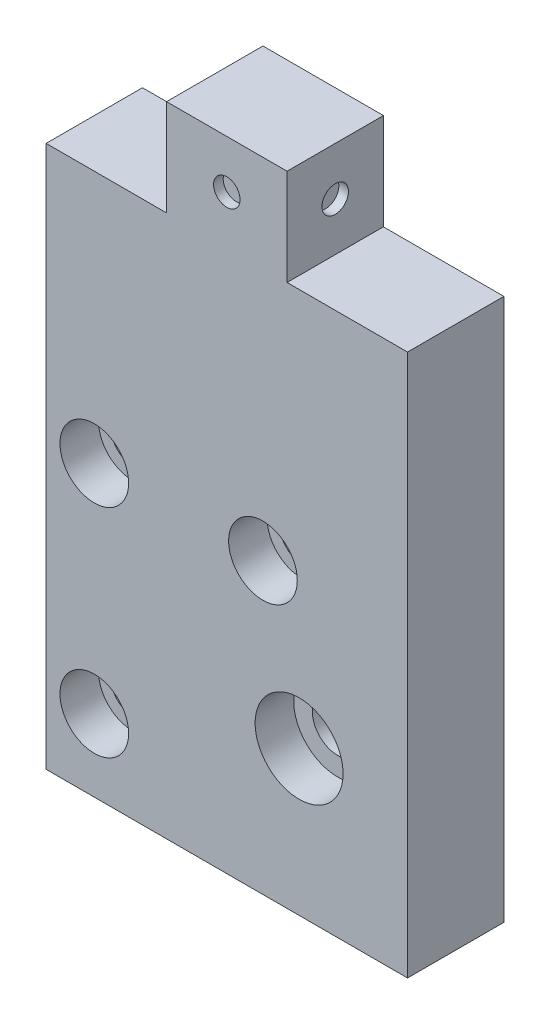
ISO-10303-21;
HEADER;
FILE_DESCRIPTION(('STEP AP214'),'2;1');
FILE_NAME('part.step','',(''),(''),'','','');
FILE_SCHEMA(('AUTOMOTIVE_DESIGN { 1 0 10303 214 1 1 1 1 }'));
ENDSEC;
DATA;
#1=APPLICATION_CONTEXT('core data for automotive mechanical design processes');
#2=APPLICATION_PROTOCOL_DEFINITION('international standard','automotive_design',2000,#1);
#3=PRODUCT_CONTEXT('',#1,'mechanical');
#4=PRODUCT('Part','Part','',(#3));
#5=PRODUCT_RELATED_PRODUCT_CATEGORY('part','',(#4));
#6=PRODUCT_DEFINITION_FORMATION('','',#4);
#7=PRODUCT_DEFINITION_CONTEXT('part definition',#1,'design');
#8=PRODUCT_DEFINITION('design','',#6,#7);
#9=PRODUCT_DEFINITION_SHAPE('','',#8);
#10=(LENGTH_UNIT() NAMED_UNIT(*) SI_UNIT(.MILLI.,.METRE.));
#11=(NAMED_UNIT(*) PLANE_ANGLE_UNIT() SI_UNIT($,.RADIAN.));
#12=(NAMED_UNIT(*) SI_UNIT($,.STERADIAN.) SOLID_ANGLE_UNIT());
#13=UNCERTAINTY_MEASURE_WITH_UNIT(LENGTH_MEASURE(1.E-05),#10,'distance_accuracy_value','');
#14=(GEOMETRIC_REPRESENTATION_CONTEXT(3) GLOBAL_UNCERTAINTY_ASSIGNED_CONTEXT((#13)) GLOBAL_UNIT_ASSIGNED_CONTEXT((#10,
#11,#12)) REPRESENTATION_CONTEXT('',''));
#15=CARTESIAN_POINT('',(0.,0.,0.));
#16=DIRECTION('',(0.,0.,1.));
#17=DIRECTION('',(1.,0.,0.));
#18=AXIS2_PLACEMENT_3D('',#15,#16,#17);
#19=CARTESIAN_POINT('',(5.08,7.62,10.16));
#20=DIRECTION('',(0.,0.,-1.));
#21=DIRECTION('',(-1.,0.,0.));
#22=AXIS2_PLACEMENT_3D('',#19,#20,#21);
#23=CYLINDRICAL_SURFACE('',#22,2.286);
#24=CARTESIAN_POINT('',(5.08,7.62,0.));
#25=DIRECTION('',(0.,0.,1.));
#26=DIRECTION('',(1.,0.,0.));
#27=AXIS2_PLACEMENT_3D('',#24,#25,#26);
#28=CIRCLE('',#27,2.286);
#29=CARTESIAN_POINT('',(7.366,7.62,0.));
#30=VERTEX_POINT('',#29);
#31=EDGE_CURVE('E135',#30,#30,#28,.T.);
#32=ORIENTED_EDGE('',*,*,#31,.F.);
#33=EDGE_LOOP('',(#32));
#34=FACE_BOUND('',#33,.T.);
#35=CARTESIAN_POINT('',(5.08,7.62,6.096));
#36=DIRECTION('',(0.,0.,1.));
#37=DIRECTION('',(1.,0.,0.));
#38=AXIS2_PLACEMENT_3D('',#35,#36,#37);
#39=CIRCLE('',#38,2.286);
#40=CARTESIAN_POINT('',(7.366,7.62,6.096));
#41=VERTEX_POINT('',#40);
#42=EDGE_CURVE('E36',#41,#41,#39,.T.);
#43=ORIENTED_EDGE('',*,*,#42,.T.);
#44=EDGE_LOOP('',(#43));
#45=FACE_BOUND('',#44,.T.);
#46=ADVANCED_FACE('F32',(#34,#45),#23,.F.);
#47=CARTESIAN_POINT('',(5.08,30.48,10.16));
#48=DIRECTION('',(0.,0.,-1.));
#49=DIRECTION('',(-1.,0.,0.));
#50=AXIS2_PLACEMENT_3D('',#47,#48,#49);
#51=CYLINDRICAL_SURFACE('',#50,2.286);
#52=CARTESIAN_POINT('',(5.08,30.48,0.));
#53=DIRECTION('',(0.,0.,1.));
#54=DIRECTION('',(1.,0.,0.));
#55=AXIS2_PLACEMENT_3D('',#52,#53,#54);
#56=CIRCLE('',#55,2.286);
#57=CARTESIAN_POINT('',(7.366,30.48,0.));
#58=VERTEX_POINT('',#57);
#59=EDGE_CURVE('E178',#58,#58,#56,.T.);
#60=ORIENTED_EDGE('',*,*,#59,.F.);
#61=EDGE_LOOP('',(#60));
#62=FACE_BOUND('',#61,.T.);
#63=CARTESIAN_POINT('',(5.08,30.48,6.096));
#64=DIRECTION('',(0.,0.,1.));
#65=DIRECTION('',(1.,0.,0.));
#66=AXIS2_PLACEMENT_3D('',#63,#64,#65);
#67=CIRCLE('',#66,2.286);
#68=CARTESIAN_POINT('',(7.366,30.48,6.096));
#69=VERTEX_POINT('',#68);
#70=EDGE_CURVE('E164',#69,#69,#67,.T.);
#71=ORIENTED_EDGE('',*,*,#70,.T.);
#72=EDGE_LOOP('',(#71));
#73=FACE_BOUND('',#72,.T.);
#74=ADVANCED_FACE('F226',(#62,#73),#51,.F.);
#75=CARTESIAN_POINT('',(26.67,15.24,10.16));
#76=DIRECTION('',(0.,0.,-1.));
#77=DIRECTION('',(-1.,0.,0.));
#78=AXIS2_PLACEMENT_3D('',#75,#76,#77);
#79=CYLINDRICAL_SURFACE('',#78,2.667);
#80=CARTESIAN_POINT('',(26.67,15.24,0.));
#81=DIRECTION('',(0.,0.,1.));
#82=DIRECTION('',(1.,0.,0.));
#83=AXIS2_PLACEMENT_3D('',#80,#81,#82);
#84=CIRCLE('',#83,2.667);
#85=CARTESIAN_POINT('',(29.337,15.24,0.));
#86=VERTEX_POINT('',#85);
#87=EDGE_CURVE('E173',#86,#86,#84,.T.);
#88=ORIENTED_EDGE('',*,*,#87,.F.);
#89=EDGE_LOOP('',(#88));
#90=FACE_BOUND('',#89,.T.);
#91=CARTESIAN_POINT('',(26.67,15.24,6.096));
#92=DIRECTION('',(0.,0.,1.));
#93=DIRECTION('',(1.,0.,0.));
#94=AXIS2_PLACEMENT_3D('',#91,#92,#93);
#95=CIRCLE('',#94,2.667);
#96=CARTESIAN_POINT('',(29.337,15.24,6.096));
#97=VERTEX_POINT('',#96);
#98=EDGE_CURVE('E161',#97,#97,#95,.T.);
#99=ORIENTED_EDGE('',*,*,#98,.T.);
#100=EDGE_LOOP('',(#99));
#101=FACE_BOUND('',#100,.T.);
#102=ADVANCED_FACE('F232',(#90,#101),#79,.F.);
#103=CARTESIAN_POINT('',(22.86,30.48,10.16));
#104=DIRECTION('',(0.,0.,-1.));
#105=DIRECTION('',(-1.,0.,0.));
#106=AXIS2_PLACEMENT_3D('',#103,#104,#105);
#107=CYLINDRICAL_SURFACE('',#106,2.286);
#108=CARTESIAN_POINT('',(22.86,30.48,0.));
#109=DIRECTION('',(0.,0.,1.));
#110=DIRECTION('',(1.,0.,0.));
#111=AXIS2_PLACEMENT_3D('',#108,#109,#110);
#112=CIRCLE('',#111,2.286);
#113=CARTESIAN_POINT('',(25.146,30.48,0.));
#114=VERTEX_POINT('',#113);
#115=EDGE_CURVE('E169',#114,#114,#112,.T.);
#116=ORIENTED_EDGE('',*,*,#115,.F.);
#117=EDGE_LOOP('',(#116));
#118=FACE_BOUND('',#117,.T.);
#119=CARTESIAN_POINT('',(22.86,30.48,6.096));
#120=DIRECTION('',(0.,0.,1.));
#121=DIRECTION('',(1.,0.,0.));
#122=AXIS2_PLACEMENT_3D('',#119,#120,#121);
#123=CIRCLE('',#122,2.286);
#124=CARTESIAN_POINT('',(25.146,30.48,6.096));
#125=VERTEX_POINT('',#124);
#126=EDGE_CURVE('E158',#125,#125,#123,.T.);
#127=ORIENTED_EDGE('',*,*,#126,.T.);
#128=EDGE_LOOP('',(#127));
#129=FACE_BOUND('',#128,.T.);
#130=ADVANCED_FACE('F239',(#118,#129),#107,.F.);
#131=CARTESIAN_POINT('',(0.,0.,10.16));
#132=DIRECTION('',(0.,0.,1.));
#133=DIRECTION('',(1.,0.,0.));
#134=AXIS2_PLACEMENT_3D('',#131,#132,#133);
#135=PLANE('',#134);
#136=CARTESIAN_POINT('',(19.05,62.23,10.16));
#137=DIRECTION('',(0.,0.,-1.));
#138=DIRECTION('',(-1.,0.,0.));
#139=AXIS2_PLACEMENT_3D('',#136,#137,#138);
#140=CIRCLE('',#139,1.397);
#141=CARTESIAN_POINT('',(17.653,62.23,10.16));
#142=VERTEX_POINT('',#141);
#143=EDGE_CURVE('E368',#142,#142,#140,.T.);
#144=ORIENTED_EDGE('',*,*,#143,.T.);
#145=EDGE_LOOP('',(#144));
#146=FACE_BOUND('',#145,.T.);
#147=CARTESIAN_POINT('',(22.86,30.48,10.16));
#148=DIRECTION('',(0.,0.,1.));
#149=DIRECTION('',(1.,0.,0.));
#150=AXIS2_PLACEMENT_3D('',#147,#148,#149);
#151=CIRCLE('',#150,3.6195);
#152=CARTESIAN_POINT('',(26.4795,30.48,10.16));
#153=VERTEX_POINT('',#152);
#154=EDGE_CURVE('E374',#153,#153,#151,.T.);
#155=ORIENTED_EDGE('',*,*,#154,.F.);
#156=EDGE_LOOP('',(#155));
#157=FACE_BOUND('',#156,.T.);
#158=CARTESIAN_POINT('',(5.08,7.62,10.16));
#159=DIRECTION('',(0.,0.,1.));
#160=DIRECTION('',(1.,0.,0.));
#161=AXIS2_PLACEMENT_3D('',#158,#159,#160);
#162=CIRCLE('',#161,3.6195);
#163=CARTESIAN_POINT('',(8.6995,7.62,10.16));
#164=VERTEX_POINT('',#163);
#165=EDGE_CURVE('E358',#164,#164,#162,.T.);
#166=ORIENTED_EDGE('',*,*,#165,.F.);
#167=EDGE_LOOP('',(#166));
#168=FACE_BOUND('',#167,.T.);
#169=CARTESIAN_POINT('',(26.67,15.24,10.16));
#170=DIRECTION('',(0.,0.,1.));
#171=DIRECTION('',(1.,0.,0.));
#172=AXIS2_PLACEMENT_3D('',#169,#170,#171);
#173=CIRCLE('',#172,4.6355);
#174=CARTESIAN_POINT('',(31.3055,15.24,10.16));
#175=VERTEX_POINT('',#174);
#176=EDGE_CURVE('E359',#175,#175,#173,.T.);
#177=ORIENTED_EDGE('',*,*,#176,.F.);
#178=EDGE_LOOP('',(#177));
#179=FACE_BOUND('',#178,.T.);
#180=CARTESIAN_POINT('',(5.08,30.48,10.16));
#181=DIRECTION('',(0.,0.,1.));
#182=DIRECTION('',(1.,0.,0.));
#183=AXIS2_PLACEMENT_3D('',#180,#181,#182);
#184=CIRCLE('',#183,3.6195);
#185=CARTESIAN_POINT('',(8.6995,30.48,10.16));
#186=VERTEX_POINT('',#185);
#187=EDGE_CURVE('E181',#186,#186,#184,.T.);
#188=ORIENTED_EDGE('',*,*,#187,.F.);
#189=EDGE_LOOP('',(#188));
#190=FACE_BOUND('',#189,.T.);
#191=DIRECTION('',(0.,-1.,0.));
#192=VECTOR('',#191,1.);
#193=CARTESIAN_POINT('',(0.,57.15,10.16));
#194=LINE('',#193,#192);
#195=CARTESIAN_POINT('',(0.,57.15,10.16));
#196=VERTEX_POINT('',#195);
#197=CARTESIAN_POINT('',(0.,0.,10.16));
#198=VERTEX_POINT('',#197);
#199=EDGE_CURVE('E146',#196,#198,#194,.T.);
#200=ORIENTED_EDGE('',*,*,#199,.T.);
#201=DIRECTION('',(1.,0.,0.));
#202=VECTOR('',#201,1.);
#203=CARTESIAN_POINT('',(0.,0.,10.16));
#204=LINE('',#203,#202);
#205=CARTESIAN_POINT('',(38.1,0.,10.16));
#206=VERTEX_POINT('',#205);
#207=EDGE_CURVE('E94',#198,#206,#204,.T.);
#208=ORIENTED_EDGE('',*,*,#207,.T.);
#209=DIRECTION('',(0.,1.,0.));
#210=VECTOR('',#209,1.);
#211=CARTESIAN_POINT('',(38.1,57.15,10.16));
#212=LINE('',#211,#210);
#213=CARTESIAN_POINT('',(38.1,57.15,10.16));
#214=VERTEX_POINT('',#213);
#215=EDGE_CURVE('E190',#206,#214,#212,.T.);
#216=ORIENTED_EDGE('',*,*,#215,.T.);
#217=DIRECTION('',(-1.,0.,0.));
#218=VECTOR('',#217,1.);
#219=CARTESIAN_POINT('',(25.4,57.15,10.16));
#220=LINE('',#219,#218);
#221=CARTESIAN_POINT('',(25.4,57.15,10.16));
#222=VERTEX_POINT('',#221);
#223=EDGE_CURVE('E192',#214,#222,#220,.T.);
#224=ORIENTED_EDGE('',*,*,#223,.T.);
#225=DIRECTION('',(0.,1.,0.));
#226=VECTOR('',#225,1.);
#227=CARTESIAN_POINT('',(25.4,67.31,10.16));
#228=LINE('',#227,#226);
#229=CARTESIAN_POINT('',(25.4,67.31,10.16));
#230=VERTEX_POINT('',#229);
#231=EDGE_CURVE('E113',#222,#230,#228,.T.);
#232=ORIENTED_EDGE('',*,*,#231,.T.);
#233=DIRECTION('',(-1.,0.,0.));
#234=VECTOR('',#233,1.);
#235=CARTESIAN_POINT('',(12.7,67.31,10.16));
#236=LINE('',#235,#234);
#237=CARTESIAN_POINT('',(12.7,67.31,10.16));
#238=VERTEX_POINT('',#237);
#239=EDGE_CURVE('E107',#230,#238,#236,.T.);
#240=ORIENTED_EDGE('',*,*,#239,.T.);
#241=DIRECTION('',(0.,-1.,0.));
#242=VECTOR('',#241,1.);
#243=CARTESIAN_POINT('',(12.7,57.15,10.16));
#244=LINE('',#243,#242);
#245=CARTESIAN_POINT('',(12.7,57.15,10.16));
#246=VERTEX_POINT('',#245);
#247=EDGE_CURVE('E111',#238,#246,#244,.T.);
#248=ORIENTED_EDGE('',*,*,#247,.T.);
#249=DIRECTION('',(-1.,0.,0.));
#250=VECTOR('',#249,1.);
#251=CARTESIAN_POINT('',(0.,57.15,10.16));
#252=LINE('',#251,#250);
#253=EDGE_CURVE('E51',#246,#196,#252,.T.);
#254=ORIENTED_EDGE('',*,*,#253,.T.);
#255=EDGE_LOOP('',(#200,#208,#216,#224,#232,#240,#248,#254));
#256=FACE_BOUND('',#255,.T.);
#257=ADVANCED_FACE('F109',(#146,#157,#168,#179,#190,#256),#135,.T.);
#258=CARTESIAN_POINT('',(0.,0.,0.));
#259=DIRECTION('',(0.,0.,1.));
#260=DIRECTION('',(1.,0.,0.));
#261=AXIS2_PLACEMENT_3D('',#258,#259,#260);
#262=PLANE('',#261);
#263=DIRECTION('',(0.,-1.,0.));
#264=VECTOR('',#263,1.);
#265=CARTESIAN_POINT('',(0.,57.15,0.));
#266=LINE('',#265,#264);
#267=CARTESIAN_POINT('',(0.,57.15,0.));
#268=VERTEX_POINT('',#267);
#269=CARTESIAN_POINT('',(0.,0.,0.));
#270=VERTEX_POINT('',#269);
#271=EDGE_CURVE('E131',#268,#270,#266,.T.);
#272=ORIENTED_EDGE('',*,*,#271,.F.);
#273=DIRECTION('',(-1.,0.,0.));
#274=VECTOR('',#273,1.);
#275=CARTESIAN_POINT('',(0.,57.15,0.));
#276=LINE('',#275,#274);
#277=CARTESIAN_POINT('',(12.7,57.15,0.));
#278=VERTEX_POINT('',#277);
#279=EDGE_CURVE('E86',#278,#268,#276,.T.);
#280=ORIENTED_EDGE('',*,*,#279,.F.);
#281=DIRECTION('',(0.,-1.,0.));
#282=VECTOR('',#281,1.);
#283=CARTESIAN_POINT('',(12.7,57.15,0.));
#284=LINE('',#283,#282);
#285=CARTESIAN_POINT('',(12.7,67.31,0.));
#286=VERTEX_POINT('',#285);
#287=EDGE_CURVE('E80',#286,#278,#284,.T.);
#288=ORIENTED_EDGE('',*,*,#287,.F.);
#289=DIRECTION('',(-1.,0.,0.));
#290=VECTOR('',#289,1.);
#291=CARTESIAN_POINT('',(12.7,67.31,0.));
#292=LINE('',#291,#290);
#293=CARTESIAN_POINT('',(25.4,67.31,0.));
#294=VERTEX_POINT('',#293);
#295=EDGE_CURVE('E121',#294,#286,#292,.T.);
#296=ORIENTED_EDGE('',*,*,#295,.F.);
#297=DIRECTION('',(0.,1.,0.));
#298=VECTOR('',#297,1.);
#299=CARTESIAN_POINT('',(25.4,67.31,0.));
#300=LINE('',#299,#298);
#301=CARTESIAN_POINT('',(25.4,57.15,0.));
#302=VERTEX_POINT('',#301);
#303=EDGE_CURVE('E141',#302,#294,#300,.T.);
#304=ORIENTED_EDGE('',*,*,#303,.F.);
#305=DIRECTION('',(-1.,0.,0.));
#306=VECTOR('',#305,1.);
#307=CARTESIAN_POINT('',(25.4,57.15,0.));
#308=LINE('',#307,#306);
#309=CARTESIAN_POINT('',(38.1,57.15,0.));
#310=VERTEX_POINT('',#309);
#311=EDGE_CURVE('E139',#310,#302,#308,.T.);
#312=ORIENTED_EDGE('',*,*,#311,.F.);
#313=DIRECTION('',(0.,1.,0.));
#314=VECTOR('',#313,1.);
#315=CARTESIAN_POINT('',(38.1,57.15,0.));
#316=LINE('',#315,#314);
#317=CARTESIAN_POINT('',(38.1,0.,0.));
#318=VERTEX_POINT('',#317);
#319=EDGE_CURVE('E137',#318,#310,#316,.T.);
#320=ORIENTED_EDGE('',*,*,#319,.F.);
#321=DIRECTION('',(1.,0.,0.));
#322=VECTOR('',#321,1.);
#323=CARTESIAN_POINT('',(0.,0.,0.));
#324=LINE('',#323,#322);
#325=EDGE_CURVE('E134',#270,#318,#324,.T.);
#326=ORIENTED_EDGE('',*,*,#325,.F.);
#327=EDGE_LOOP('',(#272,#280,#288,#296,#304,#312,#320,#326));
#328=FACE_BOUND('',#327,.T.);
#329=ORIENTED_EDGE('',*,*,#31,.T.);
#330=EDGE_LOOP('',(#329));
#331=FACE_BOUND('',#330,.T.);
#332=ORIENTED_EDGE('',*,*,#59,.T.);
#333=EDGE_LOOP('',(#332));
#334=FACE_BOUND('',#333,.T.);
#335=ORIENTED_EDGE('',*,*,#87,.T.);
#336=EDGE_LOOP('',(#335));
#337=FACE_BOUND('',#336,.T.);
#338=ORIENTED_EDGE('',*,*,#115,.T.);
#339=EDGE_LOOP('',(#338));
#340=FACE_BOUND('',#339,.T.);
#341=ADVANCED_FACE('F205',(#328,#331,#334,#337,#340),#262,.F.);
#342=CARTESIAN_POINT('',(0.,57.15,10.16));
#343=DIRECTION('',(1.,0.,0.));
#344=DIRECTION('',(0.,0.,-1.));
#345=AXIS2_PLACEMENT_3D('',#342,#343,#344);
#346=PLANE('',#345);
#347=ORIENTED_EDGE('',*,*,#271,.T.);
#348=DIRECTION('',(0.,0.,-1.));
#349=VECTOR('',#348,1.);
#350=CARTESIAN_POINT('',(0.,0.,10.16));
#351=LINE('',#350,#349);
#352=EDGE_CURVE('E11',#198,#270,#351,.T.);
#353=ORIENTED_EDGE('',*,*,#352,.F.);
#354=ORIENTED_EDGE('',*,*,#199,.F.);
#355=DIRECTION('',(0.,0.,-1.));
#356=VECTOR('',#355,1.);
#357=CARTESIAN_POINT('',(0.,57.15,10.16));
#358=LINE('',#357,#356);
#359=EDGE_CURVE('E127',#196,#268,#358,.T.);
#360=ORIENTED_EDGE('',*,*,#359,.T.);
#361=EDGE_LOOP('',(#347,#353,#354,#360));
#362=FACE_BOUND('',#361,.T.);
#363=ADVANCED_FACE('F34',(#362),#346,.F.);
#364=CARTESIAN_POINT('',(0.,0.,10.16));
#365=DIRECTION('',(0.,1.,0.));
#366=DIRECTION('',(0.,0.,1.));
#367=AXIS2_PLACEMENT_3D('',#364,#365,#366);
#368=PLANE('',#367);
#369=ORIENTED_EDGE('',*,*,#325,.T.);
#370=DIRECTION('',(0.,0.,-1.));
#371=VECTOR('',#370,1.);
#372=CARTESIAN_POINT('',(38.1,0.,10.16));
#373=LINE('',#372,#371);
#374=EDGE_CURVE('E42',#206,#318,#373,.T.);
#375=ORIENTED_EDGE('',*,*,#374,.F.);
#376=ORIENTED_EDGE('',*,*,#207,.F.);
#377=ORIENTED_EDGE('',*,*,#352,.T.);
#378=EDGE_LOOP('',(#369,#375,#376,#377));
#379=FACE_BOUND('',#378,.T.);
#380=ADVANCED_FACE('F245',(#379),#368,.F.);
#381=CARTESIAN_POINT('',(38.1,57.15,10.16));
#382=DIRECTION('',(-1.,0.,0.));
#383=DIRECTION('',(0.,0.,1.));
#384=AXIS2_PLACEMENT_3D('',#381,#382,#383);
#385=PLANE('',#384);
#386=ORIENTED_EDGE('',*,*,#319,.T.);
#387=DIRECTION('',(0.,0.,-1.));
#388=VECTOR('',#387,1.);
#389=CARTESIAN_POINT('',(38.1,57.15,10.16));
#390=LINE('',#389,#388);
#391=EDGE_CURVE('E153',#214,#310,#390,.T.);
#392=ORIENTED_EDGE('',*,*,#391,.F.);
#393=ORIENTED_EDGE('',*,*,#215,.F.);
#394=ORIENTED_EDGE('',*,*,#374,.T.);
#395=EDGE_LOOP('',(#386,#392,#393,#394));
#396=FACE_BOUND('',#395,.T.);
#397=ADVANCED_FACE('F249',(#396),#385,.F.);
#398=CARTESIAN_POINT('',(25.4,57.15,10.16));
#399=DIRECTION('',(0.,-1.,0.));
#400=DIRECTION('',(1.,0.,0.));
#401=AXIS2_PLACEMENT_3D('',#398,#399,#400);
#402=PLANE('',#401);
#403=ORIENTED_EDGE('',*,*,#311,.T.);
#404=DIRECTION('',(0.,0.,-1.));
#405=VECTOR('',#404,1.);
#406=CARTESIAN_POINT('',(25.4,57.15,10.16));
#407=LINE('',#406,#405);
#408=EDGE_CURVE('E150',#222,#302,#407,.T.);
#409=ORIENTED_EDGE('',*,*,#408,.F.);
#410=ORIENTED_EDGE('',*,*,#223,.F.);
#411=ORIENTED_EDGE('',*,*,#391,.T.);
#412=EDGE_LOOP('',(#403,#409,#410,#411));
#413=FACE_BOUND('',#412,.T.);
#414=ADVANCED_FACE('F198',(#413),#402,.F.);
#415=CARTESIAN_POINT('',(25.4,67.31,10.16));
#416=DIRECTION('',(-1.,0.,0.));
#417=DIRECTION('',(0.,0.,1.));
#418=AXIS2_PLACEMENT_3D('',#415,#416,#417);
#419=PLANE('',#418);
#420=CARTESIAN_POINT('',(25.4,62.23,5.08));
#421=DIRECTION('',(1.,0.,0.));
#422=DIRECTION('',(0.,0.,-1.));
#423=AXIS2_PLACEMENT_3D('',#420,#421,#422);
#424=CIRCLE('',#423,1.397);
#425=CARTESIAN_POINT('',(25.4,62.23,3.683));
#426=VERTEX_POINT('',#425);
#427=EDGE_CURVE('E402',#426,#426,#424,.T.);
#428=ORIENTED_EDGE('',*,*,#427,.F.);
#429=EDGE_LOOP('',(#428));
#430=FACE_BOUND('',#429,.T.);
#431=ORIENTED_EDGE('',*,*,#303,.T.);
#432=DIRECTION('',(0.,0.,-1.));
#433=VECTOR('',#432,1.);
#434=CARTESIAN_POINT('',(25.4,67.31,10.16));
#435=LINE('',#434,#433);
#436=EDGE_CURVE('E122',#230,#294,#435,.T.);
#437=ORIENTED_EDGE('',*,*,#436,.F.);
#438=ORIENTED_EDGE('',*,*,#231,.F.);
#439=ORIENTED_EDGE('',*,*,#408,.T.);
#440=EDGE_LOOP('',(#431,#437,#438,#439));
#441=FACE_BOUND('',#440,.T.);
#442=ADVANCED_FACE('F202',(#430,#441),#419,.F.);
#443=CARTESIAN_POINT('',(12.7,67.31,10.16));
#444=DIRECTION('',(0.,-1.,0.));
#445=DIRECTION('',(0.,0.,-1.));
#446=AXIS2_PLACEMENT_3D('',#443,#444,#445);
#447=PLANE('',#446);
#448=ORIENTED_EDGE('',*,*,#295,.T.);
#449=DIRECTION('',(0.,0.,-1.));
#450=VECTOR('',#449,1.);
#451=CARTESIAN_POINT('',(12.7,67.31,10.16));
#452=LINE('',#451,#450);
#453=EDGE_CURVE('E118',#238,#286,#452,.T.);
#454=ORIENTED_EDGE('',*,*,#453,.F.);
#455=ORIENTED_EDGE('',*,*,#239,.F.);
#456=ORIENTED_EDGE('',*,*,#436,.T.);
#457=EDGE_LOOP('',(#448,#454,#455,#456));
#458=FACE_BOUND('',#457,.T.);
#459=ADVANCED_FACE('F119',(#458),#447,.F.);
#460=CARTESIAN_POINT('',(12.7,57.15,10.16));
#461=DIRECTION('',(1.,0.,0.));
#462=DIRECTION('',(0.,0.,-1.));
#463=AXIS2_PLACEMENT_3D('',#460,#461,#462);
#464=PLANE('',#463);
#465=CARTESIAN_POINT('',(12.7,62.23,5.08));
#466=DIRECTION('',(-1.,0.,0.));
#467=DIRECTION('',(0.,0.,1.));
#468=AXIS2_PLACEMENT_3D('',#465,#466,#467);
#469=CIRCLE('',#468,1.397);
#470=CARTESIAN_POINT('',(12.7,62.23,6.477));
#471=VERTEX_POINT('',#470);
#472=EDGE_CURVE('E408',#471,#471,#469,.T.);
#473=ORIENTED_EDGE('',*,*,#472,.F.);
#474=EDGE_LOOP('',(#473));
#475=FACE_BOUND('',#474,.T.);
#476=ORIENTED_EDGE('',*,*,#287,.T.);
#477=DIRECTION('',(0.,0.,-1.));
#478=VECTOR('',#477,1.);
#479=CARTESIAN_POINT('',(12.7,57.15,10.16));
#480=LINE('',#479,#478);
#481=EDGE_CURVE('E123',#246,#278,#480,.T.);
#482=ORIENTED_EDGE('',*,*,#481,.F.);
#483=ORIENTED_EDGE('',*,*,#247,.F.);
#484=ORIENTED_EDGE('',*,*,#453,.T.);
#485=EDGE_LOOP('',(#476,#482,#483,#484));
#486=FACE_BOUND('',#485,.T.);
#487=ADVANCED_FACE('F125',(#475,#486),#464,.F.);
#488=CARTESIAN_POINT('',(0.,57.15,10.16));
#489=DIRECTION('',(0.,-1.,0.));
#490=DIRECTION('',(0.,0.,-1.));
#491=AXIS2_PLACEMENT_3D('',#488,#489,#490);
#492=PLANE('',#491);
#493=ORIENTED_EDGE('',*,*,#279,.T.);
#494=ORIENTED_EDGE('',*,*,#359,.F.);
#495=ORIENTED_EDGE('',*,*,#253,.F.);
#496=ORIENTED_EDGE('',*,*,#481,.T.);
#497=EDGE_LOOP('',(#493,#494,#495,#496));
#498=FACE_BOUND('',#497,.T.);
#499=ADVANCED_FACE('F211',(#498),#492,.F.);
#500=CARTESIAN_POINT('',(22.86,30.48,6.096));
#501=DIRECTION('',(0.,0.,1.));
#502=DIRECTION('',(1.,0.,0.));
#503=AXIS2_PLACEMENT_3D('',#500,#501,#502);
#504=CYLINDRICAL_SURFACE('',#503,3.6195);
#505=CARTESIAN_POINT('',(22.86,30.48,6.096));
#506=DIRECTION('',(0.,0.,1.));
#507=DIRECTION('',(1.,0.,0.));
#508=AXIS2_PLACEMENT_3D('',#505,#506,#507);
#509=CIRCLE('',#508,3.6195);
#510=CARTESIAN_POINT('',(26.4795,30.48,6.096));
#511=VERTEX_POINT('',#510);
#512=EDGE_CURVE('E371',#511,#511,#509,.T.);
#513=ORIENTED_EDGE('',*,*,#512,.F.);
#514=EDGE_LOOP('',(#513));
#515=FACE_BOUND('',#514,.T.);
#516=ORIENTED_EDGE('',*,*,#154,.T.);
#517=EDGE_LOOP('',(#516));
#518=FACE_BOUND('',#517,.T.);
#519=ADVANCED_FACE('F213',(#515,#518),#504,.F.);
#520=CARTESIAN_POINT('',(22.86,30.48,6.096));
#521=DIRECTION('',(0.,0.,1.));
#522=DIRECTION('',(1.,0.,0.));
#523=AXIS2_PLACEMENT_3D('',#520,#521,#522);
#524=PLANE('',#523);
#525=ORIENTED_EDGE('',*,*,#126,.F.);
#526=EDGE_LOOP('',(#525));
#527=FACE_BOUND('',#526,.T.);
#528=ORIENTED_EDGE('',*,*,#512,.T.);
#529=EDGE_LOOP('',(#528));
#530=FACE_BOUND('',#529,.T.);
#531=ADVANCED_FACE('F219',(#527,#530),#524,.T.);
#532=CARTESIAN_POINT('',(26.67,15.24,6.096));
#533=DIRECTION('',(0.,0.,1.));
#534=DIRECTION('',(1.,0.,0.));
#535=AXIS2_PLACEMENT_3D('',#532,#533,#534);
#536=CYLINDRICAL_SURFACE('',#535,4.6355);
#537=CARTESIAN_POINT('',(26.67,15.24,6.096));
#538=DIRECTION('',(0.,0.,1.));
#539=DIRECTION('',(1.,0.,0.));
#540=AXIS2_PLACEMENT_3D('',#537,#538,#539);
#541=CIRCLE('',#540,4.6355);
#542=CARTESIAN_POINT('',(31.3055,15.24,6.096));
#543=VERTEX_POINT('',#542);
#544=EDGE_CURVE('E357',#543,#543,#541,.T.);
#545=ORIENTED_EDGE('',*,*,#544,.F.);
#546=EDGE_LOOP('',(#545));
#547=FACE_BOUND('',#546,.T.);
#548=ORIENTED_EDGE('',*,*,#176,.T.);
#549=EDGE_LOOP('',(#548));
#550=FACE_BOUND('',#549,.T.);
#551=ADVANCED_FACE('F323',(#547,#550),#536,.F.);
#552=CARTESIAN_POINT('',(26.67,15.24,6.096));
#553=DIRECTION('',(0.,0.,1.));
#554=DIRECTION('',(1.,0.,0.));
#555=AXIS2_PLACEMENT_3D('',#552,#553,#554);
#556=PLANE('',#555);
#557=ORIENTED_EDGE('',*,*,#98,.F.);
#558=EDGE_LOOP('',(#557));
#559=FACE_BOUND('',#558,.T.);
#560=ORIENTED_EDGE('',*,*,#544,.T.);
#561=EDGE_LOOP('',(#560));
#562=FACE_BOUND('',#561,.T.);
#563=ADVANCED_FACE('F319',(#559,#562),#556,.T.);
#564=CARTESIAN_POINT('',(5.08,30.48,6.096));
#565=DIRECTION('',(0.,0.,1.));
#566=DIRECTION('',(1.,0.,0.));
#567=AXIS2_PLACEMENT_3D('',#564,#565,#566);
#568=CYLINDRICAL_SURFACE('',#567,3.6195);
#569=CARTESIAN_POINT('',(5.08,30.48,6.096));
#570=DIRECTION('',(0.,0.,1.));
#571=DIRECTION('',(1.,0.,0.));
#572=AXIS2_PLACEMENT_3D('',#569,#570,#571);
#573=CIRCLE('',#572,3.6195);
#574=CARTESIAN_POINT('',(8.6995,30.48,6.096));
#575=VERTEX_POINT('',#574);
#576=EDGE_CURVE('E162',#575,#575,#573,.T.);
#577=ORIENTED_EDGE('',*,*,#576,.F.);
#578=EDGE_LOOP('',(#577));
#579=FACE_BOUND('',#578,.T.);
#580=ORIENTED_EDGE('',*,*,#187,.T.);
#581=EDGE_LOOP('',(#580));
#582=FACE_BOUND('',#581,.T.);
#583=ADVANCED_FACE('F322',(#579,#582),#568,.F.);
#584=CARTESIAN_POINT('',(5.08,30.48,6.096));
#585=DIRECTION('',(0.,0.,1.));
#586=DIRECTION('',(1.,0.,0.));
#587=AXIS2_PLACEMENT_3D('',#584,#585,#586);
#588=PLANE('',#587);
#589=ORIENTED_EDGE('',*,*,#70,.F.);
#590=EDGE_LOOP('',(#589));
#591=FACE_BOUND('',#590,.T.);
#592=ORIENTED_EDGE('',*,*,#576,.T.);
#593=EDGE_LOOP('',(#592));
#594=FACE_BOUND('',#593,.T.);
#595=ADVANCED_FACE('F337',(#591,#594),#588,.T.);
#596=CARTESIAN_POINT('',(5.08,7.62,6.096));
#597=DIRECTION('',(0.,0.,1.));
#598=DIRECTION('',(1.,0.,0.));
#599=AXIS2_PLACEMENT_3D('',#596,#597,#598);
#600=CYLINDRICAL_SURFACE('',#599,3.6195);
#601=CARTESIAN_POINT('',(5.08,7.62,6.096));
#602=DIRECTION('',(0.,0.,1.));
#603=DIRECTION('',(1.,0.,0.));
#604=AXIS2_PLACEMENT_3D('',#601,#602,#603);
#605=CIRCLE('',#604,3.6195);
#606=CARTESIAN_POINT('',(8.6995,7.62,6.096));
#607=VERTEX_POINT('',#606);
#608=EDGE_CURVE('E362',#607,#607,#605,.T.);
#609=ORIENTED_EDGE('',*,*,#608,.F.);
#610=EDGE_LOOP('',(#609));
#611=FACE_BOUND('',#610,.T.);
#612=ORIENTED_EDGE('',*,*,#165,.T.);
#613=EDGE_LOOP('',(#612));
#614=FACE_BOUND('',#613,.T.);
#615=ADVANCED_FACE('F333',(#611,#614),#600,.F.);
#616=CARTESIAN_POINT('',(5.08,7.62,6.096));
#617=DIRECTION('',(0.,0.,1.));
#618=DIRECTION('',(1.,0.,0.));
#619=AXIS2_PLACEMENT_3D('',#616,#617,#618);
#620=PLANE('',#619);
#621=ORIENTED_EDGE('',*,*,#42,.F.);
#622=EDGE_LOOP('',(#621));
#623=FACE_BOUND('',#622,.T.);
#624=ORIENTED_EDGE('',*,*,#608,.T.);
#625=EDGE_LOOP('',(#624));
#626=FACE_BOUND('',#625,.T.);
#627=ADVANCED_FACE('F317',(#623,#626),#620,.T.);
#628=CARTESIAN_POINT('',(19.05,62.23,9.144));
#629=DIRECTION('',(0.,0.,1.));
#630=DIRECTION('',(1.,0.,0.));
#631=AXIS2_PLACEMENT_3D('',#628,#629,#630);
#632=CYLINDRICAL_SURFACE('',#631,1.397);
#633=CARTESIAN_POINT('',(19.05,62.23,9.144));
#634=DIRECTION('',(0.,0.,-1.));
#635=DIRECTION('',(-1.,0.,0.));
#636=AXIS2_PLACEMENT_3D('',#633,#634,#635);
#637=CIRCLE('',#636,1.397);
#638=CARTESIAN_POINT('',(17.653,62.23,9.144));
#639=VERTEX_POINT('',#638);
#640=EDGE_CURVE('E365',#639,#639,#637,.T.);
#641=ORIENTED_EDGE('',*,*,#640,.T.);
#642=EDGE_LOOP('',(#641));
#643=FACE_BOUND('',#642,.T.);
#644=ORIENTED_EDGE('',*,*,#143,.F.);
#645=EDGE_LOOP('',(#644));
#646=FACE_BOUND('',#645,.T.);
#647=ADVANCED_FACE('F313',(#643,#646),#632,.F.);
#648=CARTESIAN_POINT('',(19.05,62.23,9.144));
#649=DIRECTION('',(0.,0.,-1.));
#650=DIRECTION('',(-1.,0.,0.));
#651=AXIS2_PLACEMENT_3D('',#648,#649,#650);
#652=PLANE('',#651);
#653=ORIENTED_EDGE('',*,*,#640,.F.);
#654=EDGE_LOOP('',(#653));
#655=FACE_BOUND('',#654,.T.);
#656=ADVANCED_FACE('F309',(#655),#652,.F.);
#657=CARTESIAN_POINT('',(24.384,62.23,5.08));
#658=DIRECTION('',(1.,0.,0.));
#659=DIRECTION('',(0.,0.,-1.));
#660=AXIS2_PLACEMENT_3D('',#657,#658,#659);
#661=CYLINDRICAL_SURFACE('',#660,1.397);
#662=CARTESIAN_POINT('',(24.384,62.23,5.08));
#663=DIRECTION('',(1.,0.,0.));
#664=DIRECTION('',(0.,0.,-1.));
#665=AXIS2_PLACEMENT_3D('',#662,#663,#664);
#666=CIRCLE('',#665,1.397);
#667=CARTESIAN_POINT('',(24.384,62.23,3.683));
#668=VERTEX_POINT('',#667);
#669=EDGE_CURVE('E399',#668,#668,#666,.T.);
#670=ORIENTED_EDGE('',*,*,#669,.F.);
#671=EDGE_LOOP('',(#670));
#672=FACE_BOUND('',#671,.T.);
#673=ORIENTED_EDGE('',*,*,#427,.T.);
#674=EDGE_LOOP('',(#673));
#675=FACE_BOUND('',#674,.T.);
#676=ADVANCED_FACE('F305',(#672,#675),#661,.F.);
#677=CARTESIAN_POINT('',(24.384,62.23,5.08));
#678=DIRECTION('',(1.,0.,0.));
#679=DIRECTION('',(0.,0.,-1.));
#680=AXIS2_PLACEMENT_3D('',#677,#678,#679);
#681=PLANE('',#680);
#682=ORIENTED_EDGE('',*,*,#669,.T.);
#683=EDGE_LOOP('',(#682));
#684=FACE_BOUND('',#683,.T.);
#685=ADVANCED_FACE('F278',(#684),#681,.T.);
#686=CARTESIAN_POINT('',(13.716,62.23,5.08));
#687=DIRECTION('',(-1.,0.,0.));
#688=DIRECTION('',(0.,0.,1.));
#689=AXIS2_PLACEMENT_3D('',#686,#687,#688);
#690=CYLINDRICAL_SURFACE('',#689,1.397);
#691=CARTESIAN_POINT('',(13.716,62.23,5.08));
#692=DIRECTION('',(-1.,0.,0.));
#693=DIRECTION('',(0.,0.,1.));
#694=AXIS2_PLACEMENT_3D('',#691,#692,#693);
#695=CIRCLE('',#694,1.397);
#696=CARTESIAN_POINT('',(13.716,62.23,6.477));
#697=VERTEX_POINT('',#696);
#698=EDGE_CURVE('E405',#697,#697,#695,.T.);
#699=ORIENTED_EDGE('',*,*,#698,.F.);
#700=EDGE_LOOP('',(#699));
#701=FACE_BOUND('',#700,.T.);
#702=ORIENTED_EDGE('',*,*,#472,.T.);
#703=EDGE_LOOP('',(#702));
#704=FACE_BOUND('',#703,.T.);
#705=ADVANCED_FACE('F283',(#701,#704),#690,.F.);
#706=CARTESIAN_POINT('',(13.716,62.23,5.08));
#707=DIRECTION('',(-1.,0.,0.));
#708=DIRECTION('',(0.,0.,1.));
#709=AXIS2_PLACEMENT_3D('',#706,#707,#708);
#710=PLANE('',#709);
#711=ORIENTED_EDGE('',*,*,#698,.T.);
#712=EDGE_LOOP('',(#711));
#713=FACE_BOUND('',#712,.T.);
#714=ADVANCED_FACE('F288',(#713),#710,.T.);
#715=CLOSED_SHELL('',(#46,#74,#102,#130,#257,#341,#363,#380,#397,#414,#442,#459,#487,#499,#519,
#531,#551,#563,#583,#595,#615,#627,#647,#656,#676,#685,#705,#714));
#716=MANIFOLD_SOLID_BREP('B2',#715);
#717=ADVANCED_BREP_SHAPE_REPRESENTATION('',(#18,#716),#14);
#718=SHAPE_DEFINITION_REPRESENTATION(#9,#717);
ENDSEC;
END-ISO-10303-21;
